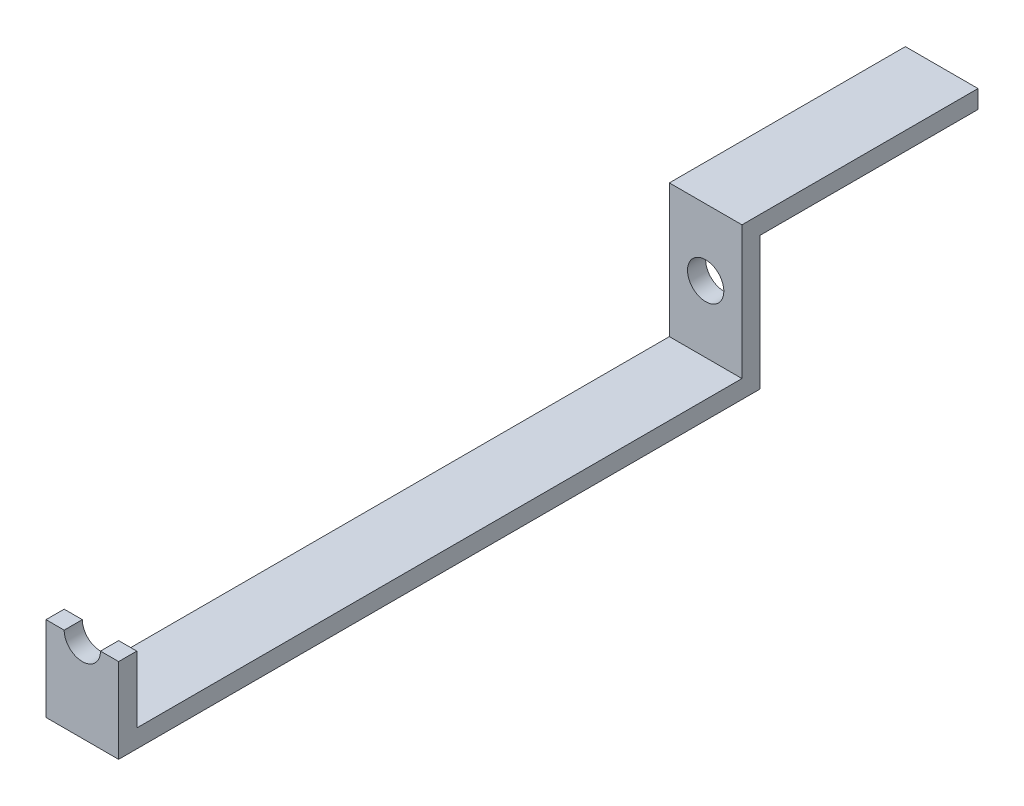
ISO-10303-21;
HEADER;
FILE_DESCRIPTION(('STEP AP214'),'2;1');
FILE_NAME('part.step','',(''),(''),'','','');
FILE_SCHEMA(('AUTOMOTIVE_DESIGN { 1 0 10303 214 1 1 1 1 }'));
ENDSEC;
DATA;
#1=APPLICATION_CONTEXT('core data for automotive mechanical design processes');
#2=APPLICATION_PROTOCOL_DEFINITION('international standard','automotive_design',2000,#1);
#3=PRODUCT_CONTEXT('',#1,'mechanical');
#4=PRODUCT('Part','Part','',(#3));
#5=PRODUCT_RELATED_PRODUCT_CATEGORY('part','',(#4));
#6=PRODUCT_DEFINITION_FORMATION('','',#4);
#7=PRODUCT_DEFINITION_CONTEXT('part definition',#1,'design');
#8=PRODUCT_DEFINITION('design','',#6,#7);
#9=PRODUCT_DEFINITION_SHAPE('','',#8);
#10=(LENGTH_UNIT() NAMED_UNIT(*) SI_UNIT(.MILLI.,.METRE.));
#11=(NAMED_UNIT(*) PLANE_ANGLE_UNIT() SI_UNIT($,.RADIAN.));
#12=(NAMED_UNIT(*) SI_UNIT($,.STERADIAN.) SOLID_ANGLE_UNIT());
#13=UNCERTAINTY_MEASURE_WITH_UNIT(LENGTH_MEASURE(1.E-05),#10,'distance_accuracy_value','');
#14=(GEOMETRIC_REPRESENTATION_CONTEXT(3) GLOBAL_UNCERTAINTY_ASSIGNED_CONTEXT((#13)) GLOBAL_UNIT_ASSIGNED_CONTEXT((#10,
#11,#12)) REPRESENTATION_CONTEXT('',''));
#15=CARTESIAN_POINT('',(0.,0.,0.));
#16=DIRECTION('',(0.,0.,1.));
#17=DIRECTION('',(1.,0.,0.));
#18=AXIS2_PLACEMENT_3D('',#15,#16,#17);
#19=CARTESIAN_POINT('',(12.,14.,53.));
#20=DIRECTION('',(0.,-1.,0.));
#21=DIRECTION('',(0.,0.,-1.));
#22=AXIS2_PLACEMENT_3D('',#19,#20,#21);
#23=PLANE('',#22);
#24=DIRECTION('',(-1.,0.,0.));
#25=VECTOR('',#24,1.);
#26=CARTESIAN_POINT('',(12.,14.,53.));
#27=LINE('',#26,#25);
#28=CARTESIAN_POINT('',(3.,14.,53.));
#29=VERTEX_POINT('',#28);
#30=CARTESIAN_POINT('',(0.,14.,53.));
#31=VERTEX_POINT('',#30);
#32=EDGE_CURVE('E197',#29,#31,#27,.T.);
#33=ORIENTED_EDGE('',*,*,#32,.F.);
#34=DIRECTION('',(0.,0.,-1.));
#35=VECTOR('',#34,1.);
#36=CARTESIAN_POINT('',(3.,14.,61.4852813742386));
#37=LINE('',#36,#35);
#38=CARTESIAN_POINT('',(3.,14.,50.));
#39=VERTEX_POINT('',#38);
#40=EDGE_CURVE('E225',#29,#39,#37,.T.);
#41=ORIENTED_EDGE('',*,*,#40,.T.);
#42=DIRECTION('',(-1.,0.,0.));
#43=VECTOR('',#42,1.);
#44=CARTESIAN_POINT('',(12.,14.,50.));
#45=LINE('',#44,#43);
#46=CARTESIAN_POINT('',(0.,14.,50.));
#47=VERTEX_POINT('',#46);
#48=EDGE_CURVE('E98',#39,#47,#45,.T.);
#49=ORIENTED_EDGE('',*,*,#48,.T.);
#50=DIRECTION('',(0.,0.,1.));
#51=VECTOR('',#50,1.);
#52=CARTESIAN_POINT('',(0.,14.,53.));
#53=LINE('',#52,#51);
#54=EDGE_CURVE('E155',#47,#31,#53,.T.);
#55=ORIENTED_EDGE('',*,*,#54,.T.);
#56=EDGE_LOOP('',(#33,#41,#49,#55));
#57=FACE_BOUND('',#56,.T.);
#58=ADVANCED_FACE('F35',(#57),#23,.F.);
#59=CARTESIAN_POINT('',(12.,14.,50.));
#60=VERTEX_POINT('',#59);
#61=CARTESIAN_POINT('',(9.,14.,50.));
#62=VERTEX_POINT('',#61);
#63=EDGE_CURVE('E178',#60,#62,#45,.T.);
#64=ORIENTED_EDGE('',*,*,#63,.T.);
#65=DIRECTION('',(0.,0.,-1.));
#66=VECTOR('',#65,1.);
#67=CARTESIAN_POINT('',(9.,14.,61.4852813742386));
#68=LINE('',#67,#66);
#69=CARTESIAN_POINT('',(9.,14.,53.));
#70=VERTEX_POINT('',#69);
#71=EDGE_CURVE('E50',#62,#70,#68,.F.);
#72=ORIENTED_EDGE('',*,*,#71,.T.);
#73=CARTESIAN_POINT('',(12.,14.,53.));
#74=VERTEX_POINT('',#73);
#75=EDGE_CURVE('E43',#74,#70,#27,.T.);
#76=ORIENTED_EDGE('',*,*,#75,.F.);
#77=DIRECTION('',(0.,0.,1.));
#78=VECTOR('',#77,1.);
#79=CARTESIAN_POINT('',(12.,14.,53.));
#80=LINE('',#79,#78);
#81=EDGE_CURVE('E177',#60,#74,#80,.T.);
#82=ORIENTED_EDGE('',*,*,#81,.F.);
#83=EDGE_LOOP('',(#64,#72,#76,#82));
#84=FACE_BOUND('',#83,.T.);
#85=ADVANCED_FACE('F37',(#84),#23,.F.);
#86=CARTESIAN_POINT('',(12.,0.,53.));
#87=DIRECTION('',(0.,0.,-1.));
#88=DIRECTION('',(-1.,0.,0.));
#89=AXIS2_PLACEMENT_3D('',#86,#87,#88);
#90=PLANE('',#89);
#91=ORIENTED_EDGE('',*,*,#75,.T.);
#92=CARTESIAN_POINT('',(6.,14.,53.));
#93=DIRECTION('',(0.,0.,-1.));
#94=DIRECTION('',(-1.,0.,0.));
#95=AXIS2_PLACEMENT_3D('',#92,#93,#94);
#96=CIRCLE('',#95,3.);
#97=EDGE_CURVE('E205',#29,#70,#96,.F.);
#98=ORIENTED_EDGE('',*,*,#97,.F.);
#99=ORIENTED_EDGE('',*,*,#32,.T.);
#100=DIRECTION('',(0.,-1.,0.));
#101=VECTOR('',#100,1.);
#102=CARTESIAN_POINT('',(0.,0.,53.));
#103=LINE('',#102,#101);
#104=CARTESIAN_POINT('',(0.,0.,53.));
#105=VERTEX_POINT('',#104);
#106=EDGE_CURVE('E157',#31,#105,#103,.T.);
#107=ORIENTED_EDGE('',*,*,#106,.T.);
#108=DIRECTION('',(-1.,0.,0.));
#109=VECTOR('',#108,1.);
#110=CARTESIAN_POINT('',(12.,0.,53.));
#111=LINE('',#110,#109);
#112=CARTESIAN_POINT('',(12.,0.,53.));
#113=VERTEX_POINT('',#112);
#114=EDGE_CURVE('E195',#113,#105,#111,.T.);
#115=ORIENTED_EDGE('',*,*,#114,.F.);
#116=DIRECTION('',(0.,-1.,0.));
#117=VECTOR('',#116,1.);
#118=CARTESIAN_POINT('',(12.,0.,53.));
#119=LINE('',#118,#117);
#120=EDGE_CURVE('E107',#74,#113,#119,.T.);
#121=ORIENTED_EDGE('',*,*,#120,.F.);
#122=EDGE_LOOP('',(#91,#98,#99,#107,#115,#121));
#123=FACE_BOUND('',#122,.T.);
#124=ADVANCED_FACE('F203',(#123),#90,.F.);
#125=CARTESIAN_POINT('',(12.,0.,53.));
#126=DIRECTION('',(0.,1.,0.));
#127=DIRECTION('',(0.,0.,1.));
#128=AXIS2_PLACEMENT_3D('',#125,#126,#127);
#129=PLANE('',#128);
#130=DIRECTION('',(0.,0.,-1.));
#131=VECTOR('',#130,1.);
#132=CARTESIAN_POINT('',(0.,0.,53.));
#133=LINE('',#132,#131);
#134=CARTESIAN_POINT('',(0.,0.,-53.));
#135=VERTEX_POINT('',#134);
#136=EDGE_CURVE('E160',#105,#135,#133,.T.);
#137=ORIENTED_EDGE('',*,*,#136,.T.);
#138=DIRECTION('',(-1.,0.,0.));
#139=VECTOR('',#138,1.);
#140=CARTESIAN_POINT('',(12.,0.,-53.));
#141=LINE('',#140,#139);
#142=CARTESIAN_POINT('',(12.,0.,-53.));
#143=VERTEX_POINT('',#142);
#144=EDGE_CURVE('E192',#143,#135,#141,.T.);
#145=ORIENTED_EDGE('',*,*,#144,.F.);
#146=DIRECTION('',(0.,0.,-1.));
#147=VECTOR('',#146,1.);
#148=CARTESIAN_POINT('',(12.,0.,53.));
#149=LINE('',#148,#147);
#150=EDGE_CURVE('E234',#113,#143,#149,.T.);
#151=ORIENTED_EDGE('',*,*,#150,.F.);
#152=ORIENTED_EDGE('',*,*,#114,.T.);
#153=EDGE_LOOP('',(#137,#145,#151,#152));
#154=FACE_BOUND('',#153,.T.);
#155=ADVANCED_FACE('F219',(#154),#129,.F.);
#156=CARTESIAN_POINT('',(12.,22.,-53.));
#157=DIRECTION('',(0.,0.,1.));
#158=DIRECTION('',(1.,0.,0.));
#159=AXIS2_PLACEMENT_3D('',#156,#157,#158);
#160=PLANE('',#159);
#161=CARTESIAN_POINT('',(6.,14.,-53.));
#162=DIRECTION('',(0.,0.,-1.));
#163=DIRECTION('',(-1.,0.,0.));
#164=AXIS2_PLACEMENT_3D('',#161,#162,#163);
#165=CIRCLE('',#164,3.);
#166=CARTESIAN_POINT('',(3.,14.,-53.));
#167=VERTEX_POINT('',#166);
#168=EDGE_CURVE('E295',#167,#167,#165,.T.);
#169=ORIENTED_EDGE('',*,*,#168,.F.);
#170=EDGE_LOOP('',(#169));
#171=FACE_BOUND('',#170,.T.);
#172=DIRECTION('',(0.,1.,0.));
#173=VECTOR('',#172,1.);
#174=CARTESIAN_POINT('',(0.,22.,-53.));
#175=LINE('',#174,#173);
#176=CARTESIAN_POINT('',(0.,22.,-53.));
#177=VERTEX_POINT('',#176);
#178=EDGE_CURVE('E163',#135,#177,#175,.T.);
#179=ORIENTED_EDGE('',*,*,#178,.T.);
#180=DIRECTION('',(-1.,0.,0.));
#181=VECTOR('',#180,1.);
#182=CARTESIAN_POINT('',(12.,22.,-53.));
#183=LINE('',#182,#181);
#184=CARTESIAN_POINT('',(12.,22.,-53.));
#185=VERTEX_POINT('',#184);
#186=EDGE_CURVE('E189',#185,#177,#183,.T.);
#187=ORIENTED_EDGE('',*,*,#186,.F.);
#188=DIRECTION('',(0.,1.,0.));
#189=VECTOR('',#188,1.);
#190=CARTESIAN_POINT('',(12.,0.,-53.));
#191=LINE('',#190,#189);
#192=EDGE_CURVE('E236',#143,#185,#191,.T.);
#193=ORIENTED_EDGE('',*,*,#192,.F.);
#194=ORIENTED_EDGE('',*,*,#144,.T.);
#195=EDGE_LOOP('',(#179,#187,#193,#194));
#196=FACE_BOUND('',#195,.T.);
#197=ADVANCED_FACE('F257',(#171,#196),#160,.F.);
#198=CARTESIAN_POINT('',(12.,22.,-89.));
#199=DIRECTION('',(0.,1.,0.));
#200=DIRECTION('',(0.,0.,1.));
#201=AXIS2_PLACEMENT_3D('',#198,#199,#200);
#202=PLANE('',#201);
#203=DIRECTION('',(0.,0.,-1.));
#204=VECTOR('',#203,1.);
#205=CARTESIAN_POINT('',(0.,22.,-89.));
#206=LINE('',#205,#204);
#207=CARTESIAN_POINT('',(0.,22.,-89.));
#208=VERTEX_POINT('',#207);
#209=EDGE_CURVE('E165',#177,#208,#206,.T.);
#210=ORIENTED_EDGE('',*,*,#209,.T.);
#211=DIRECTION('',(-1.,0.,0.));
#212=VECTOR('',#211,1.);
#213=CARTESIAN_POINT('',(12.,22.,-89.));
#214=LINE('',#213,#212);
#215=CARTESIAN_POINT('',(12.,22.,-89.));
#216=VERTEX_POINT('',#215);
#217=EDGE_CURVE('E186',#216,#208,#214,.T.);
#218=ORIENTED_EDGE('',*,*,#217,.F.);
#219=DIRECTION('',(0.,0.,-1.));
#220=VECTOR('',#219,1.);
#221=CARTESIAN_POINT('',(12.,22.,-89.));
#222=LINE('',#221,#220);
#223=EDGE_CURVE('E238',#185,#216,#222,.T.);
#224=ORIENTED_EDGE('',*,*,#223,.F.);
#225=ORIENTED_EDGE('',*,*,#186,.T.);
#226=EDGE_LOOP('',(#210,#218,#224,#225));
#227=FACE_BOUND('',#226,.T.);
#228=ADVANCED_FACE('F253',(#227),#202,.F.);
#229=CARTESIAN_POINT('',(12.,25.,-89.));
#230=DIRECTION('',(0.,0.,1.));
#231=DIRECTION('',(1.,0.,0.));
#232=AXIS2_PLACEMENT_3D('',#229,#230,#231);
#233=PLANE('',#232);
#234=DIRECTION('',(0.,1.,0.));
#235=VECTOR('',#234,1.);
#236=CARTESIAN_POINT('',(0.,25.,-89.));
#237=LINE('',#236,#235);
#238=CARTESIAN_POINT('',(0.,25.,-89.));
#239=VERTEX_POINT('',#238);
#240=EDGE_CURVE('E167',#208,#239,#237,.T.);
#241=ORIENTED_EDGE('',*,*,#240,.T.);
#242=DIRECTION('',(-1.,0.,0.));
#243=VECTOR('',#242,1.);
#244=CARTESIAN_POINT('',(12.,25.,-89.));
#245=LINE('',#244,#243);
#246=CARTESIAN_POINT('',(12.,25.,-89.));
#247=VERTEX_POINT('',#246);
#248=EDGE_CURVE('E183',#247,#239,#245,.T.);
#249=ORIENTED_EDGE('',*,*,#248,.F.);
#250=DIRECTION('',(0.,1.,0.));
#251=VECTOR('',#250,1.);
#252=CARTESIAN_POINT('',(12.,25.,-89.));
#253=LINE('',#252,#251);
#254=EDGE_CURVE('E240',#216,#247,#253,.T.);
#255=ORIENTED_EDGE('',*,*,#254,.F.);
#256=ORIENTED_EDGE('',*,*,#217,.T.);
#257=EDGE_LOOP('',(#241,#249,#255,#256));
#258=FACE_BOUND('',#257,.T.);
#259=ADVANCED_FACE('F246',(#258),#233,.F.);
#260=CARTESIAN_POINT('',(12.,25.,-50.));
#261=DIRECTION('',(0.,-1.,0.));
#262=DIRECTION('',(0.,0.,-1.));
#263=AXIS2_PLACEMENT_3D('',#260,#261,#262);
#264=PLANE('',#263);
#265=DIRECTION('',(0.,0.,1.));
#266=VECTOR('',#265,1.);
#267=CARTESIAN_POINT('',(0.,25.,-50.));
#268=LINE('',#267,#266);
#269=CARTESIAN_POINT('',(0.,25.,-50.));
#270=VERTEX_POINT('',#269);
#271=EDGE_CURVE('E169',#239,#270,#268,.T.);
#272=ORIENTED_EDGE('',*,*,#271,.T.);
#273=DIRECTION('',(-1.,0.,0.));
#274=VECTOR('',#273,1.);
#275=CARTESIAN_POINT('',(12.,25.,-50.));
#276=LINE('',#275,#274);
#277=CARTESIAN_POINT('',(12.,25.,-50.));
#278=VERTEX_POINT('',#277);
#279=EDGE_CURVE('E146',#278,#270,#276,.T.);
#280=ORIENTED_EDGE('',*,*,#279,.F.);
#281=DIRECTION('',(0.,0.,1.));
#282=VECTOR('',#281,1.);
#283=CARTESIAN_POINT('',(12.,25.,-50.));
#284=LINE('',#283,#282);
#285=EDGE_CURVE('E135',#247,#278,#284,.T.);
#286=ORIENTED_EDGE('',*,*,#285,.F.);
#287=ORIENTED_EDGE('',*,*,#248,.T.);
#288=EDGE_LOOP('',(#272,#280,#286,#287));
#289=FACE_BOUND('',#288,.T.);
#290=ADVANCED_FACE('F250',(#289),#264,.F.);
#291=CARTESIAN_POINT('',(12.,20.,-50.));
#292=DIRECTION('',(0.,0.,-1.));
#293=DIRECTION('',(0.,1.,0.));
#294=AXIS2_PLACEMENT_3D('',#291,#292,#293);
#295=PLANE('',#294);
#296=CARTESIAN_POINT('',(6.,14.,-50.));
#297=DIRECTION('',(0.,0.,-1.));
#298=DIRECTION('',(0.,1.,0.));
#299=AXIS2_PLACEMENT_3D('',#296,#297,#298);
#300=CIRCLE('',#299,3.);
#301=CARTESIAN_POINT('',(6.,17.,-50.));
#302=VERTEX_POINT('',#301);
#303=EDGE_CURVE('E158',#302,#302,#300,.T.);
#304=ORIENTED_EDGE('',*,*,#303,.T.);
#305=EDGE_LOOP('',(#304));
#306=FACE_BOUND('',#305,.T.);
#307=DIRECTION('',(0.,-1.,0.));
#308=VECTOR('',#307,1.);
#309=CARTESIAN_POINT('',(0.,20.,-50.));
#310=LINE('',#309,#308);
#311=CARTESIAN_POINT('',(0.,3.00000000000001,-50.));
#312=VERTEX_POINT('',#311);
#313=EDGE_CURVE('E143',#270,#312,#310,.T.);
#314=ORIENTED_EDGE('',*,*,#313,.T.);
#315=DIRECTION('',(-1.,0.,0.));
#316=VECTOR('',#315,1.);
#317=CARTESIAN_POINT('',(12.,3.00000000000001,-50.));
#318=LINE('',#317,#316);
#319=CARTESIAN_POINT('',(12.,3.00000000000001,-50.));
#320=VERTEX_POINT('',#319);
#321=EDGE_CURVE('E141',#320,#312,#318,.T.);
#322=ORIENTED_EDGE('',*,*,#321,.F.);
#323=DIRECTION('',(0.,-1.,0.));
#324=VECTOR('',#323,1.);
#325=CARTESIAN_POINT('',(12.,20.,-50.));
#326=LINE('',#325,#324);
#327=EDGE_CURVE('E128',#278,#320,#326,.T.);
#328=ORIENTED_EDGE('',*,*,#327,.F.);
#329=ORIENTED_EDGE('',*,*,#279,.T.);
#330=EDGE_LOOP('',(#314,#322,#328,#329));
#331=FACE_BOUND('',#330,.T.);
#332=ADVANCED_FACE('F142',(#306,#331),#295,.F.);
#333=CARTESIAN_POINT('',(12.,3.00000000000001,-50.));
#334=DIRECTION('',(0.,-1.,0.));
#335=DIRECTION('',(0.,0.,-1.));
#336=AXIS2_PLACEMENT_3D('',#333,#334,#335);
#337=PLANE('',#336);
#338=DIRECTION('',(0.,0.,1.));
#339=VECTOR('',#338,1.);
#340=CARTESIAN_POINT('',(0.,3.00000000000001,-50.));
#341=LINE('',#340,#339);
#342=CARTESIAN_POINT('',(0.,3.00000000000001,50.));
#343=VERTEX_POINT('',#342);
#344=EDGE_CURVE('E173',#312,#343,#341,.T.);
#345=ORIENTED_EDGE('',*,*,#344,.T.);
#346=DIRECTION('',(-1.,0.,0.));
#347=VECTOR('',#346,1.);
#348=CARTESIAN_POINT('',(12.,3.00000000000001,50.));
#349=LINE('',#348,#347);
#350=CARTESIAN_POINT('',(12.,3.00000000000001,50.));
#351=VERTEX_POINT('',#350);
#352=EDGE_CURVE('E147',#351,#343,#349,.T.);
#353=ORIENTED_EDGE('',*,*,#352,.F.);
#354=DIRECTION('',(0.,0.,1.));
#355=VECTOR('',#354,1.);
#356=CARTESIAN_POINT('',(12.,3.00000000000001,-50.));
#357=LINE('',#356,#355);
#358=EDGE_CURVE('E132',#320,#351,#357,.T.);
#359=ORIENTED_EDGE('',*,*,#358,.F.);
#360=ORIENTED_EDGE('',*,*,#321,.T.);
#361=EDGE_LOOP('',(#345,#353,#359,#360));
#362=FACE_BOUND('',#361,.T.);
#363=ADVANCED_FACE('F149',(#362),#337,.F.);
#364=CARTESIAN_POINT('',(12.,14.,50.));
#365=DIRECTION('',(0.,0.,1.));
#366=DIRECTION('',(0.,-1.,0.));
#367=AXIS2_PLACEMENT_3D('',#364,#365,#366);
#368=PLANE('',#367);
#369=ORIENTED_EDGE('',*,*,#48,.F.);
#370=CARTESIAN_POINT('',(6.,14.,50.));
#371=DIRECTION('',(0.,0.,1.));
#372=DIRECTION('',(0.,-1.,0.));
#373=AXIS2_PLACEMENT_3D('',#370,#371,#372);
#374=CIRCLE('',#373,3.);
#375=EDGE_CURVE('E11',#39,#62,#374,.T.);
#376=ORIENTED_EDGE('',*,*,#375,.T.);
#377=ORIENTED_EDGE('',*,*,#63,.F.);
#378=DIRECTION('',(0.,1.,0.));
#379=VECTOR('',#378,1.);
#380=CARTESIAN_POINT('',(12.,14.,50.));
#381=LINE('',#380,#379);
#382=EDGE_CURVE('E58',#351,#60,#381,.T.);
#383=ORIENTED_EDGE('',*,*,#382,.F.);
#384=ORIENTED_EDGE('',*,*,#352,.T.);
#385=DIRECTION('',(0.,1.,0.));
#386=VECTOR('',#385,1.);
#387=CARTESIAN_POINT('',(0.,14.,50.));
#388=LINE('',#387,#386);
#389=EDGE_CURVE('E175',#343,#47,#388,.T.);
#390=ORIENTED_EDGE('',*,*,#389,.T.);
#391=EDGE_LOOP('',(#369,#376,#377,#383,#384,#390));
#392=FACE_BOUND('',#391,.T.);
#393=ADVANCED_FACE('F222',(#392),#368,.F.);
#394=CARTESIAN_POINT('',(12.,0.,0.));
#395=DIRECTION('',(-1.,0.,0.));
#396=DIRECTION('',(0.,0.,1.));
#397=AXIS2_PLACEMENT_3D('',#394,#395,#396);
#398=PLANE('',#397);
#399=ORIENTED_EDGE('',*,*,#81,.T.);
#400=ORIENTED_EDGE('',*,*,#120,.T.);
#401=ORIENTED_EDGE('',*,*,#150,.T.);
#402=ORIENTED_EDGE('',*,*,#192,.T.);
#403=ORIENTED_EDGE('',*,*,#223,.T.);
#404=ORIENTED_EDGE('',*,*,#254,.T.);
#405=ORIENTED_EDGE('',*,*,#285,.T.);
#406=ORIENTED_EDGE('',*,*,#327,.T.);
#407=ORIENTED_EDGE('',*,*,#358,.T.);
#408=ORIENTED_EDGE('',*,*,#382,.T.);
#409=EDGE_LOOP('',(#399,#400,#401,#402,#403,#404,#405,#406,#407,#408));
#410=FACE_BOUND('',#409,.T.);
#411=ADVANCED_FACE('F130',(#410),#398,.F.);
#412=CARTESIAN_POINT('',(0.,0.,0.));
#413=DIRECTION('',(-1.,0.,0.));
#414=DIRECTION('',(0.,0.,1.));
#415=AXIS2_PLACEMENT_3D('',#412,#413,#414);
#416=PLANE('',#415);
#417=ORIENTED_EDGE('',*,*,#54,.F.);
#418=ORIENTED_EDGE('',*,*,#389,.F.);
#419=ORIENTED_EDGE('',*,*,#344,.F.);
#420=ORIENTED_EDGE('',*,*,#313,.F.);
#421=ORIENTED_EDGE('',*,*,#271,.F.);
#422=ORIENTED_EDGE('',*,*,#240,.F.);
#423=ORIENTED_EDGE('',*,*,#209,.F.);
#424=ORIENTED_EDGE('',*,*,#178,.F.);
#425=ORIENTED_EDGE('',*,*,#136,.F.);
#426=ORIENTED_EDGE('',*,*,#106,.F.);
#427=EDGE_LOOP('',(#417,#418,#419,#420,#421,#422,#423,#424,#425,#426));
#428=FACE_BOUND('',#427,.T.);
#429=ADVANCED_FACE('F209',(#428),#416,.T.);
#430=CARTESIAN_POINT('',(6.,14.,61.4852813742386));
#431=DIRECTION('',(0.,0.,-1.));
#432=DIRECTION('',(-1.,0.,0.));
#433=AXIS2_PLACEMENT_3D('',#430,#431,#432);
#434=CYLINDRICAL_SURFACE('',#433,3.);
#435=ORIENTED_EDGE('',*,*,#97,.T.);
#436=ORIENTED_EDGE('',*,*,#71,.F.);
#437=ORIENTED_EDGE('',*,*,#375,.F.);
#438=ORIENTED_EDGE('',*,*,#40,.F.);
#439=EDGE_LOOP('',(#435,#436,#437,#438));
#440=FACE_BOUND('',#439,.T.);
#441=ADVANCED_FACE('F224',(#440),#434,.F.);
#442=ORIENTED_EDGE('',*,*,#168,.T.);
#443=EDGE_LOOP('',(#442));
#444=FACE_BOUND('',#443,.T.);
#445=ORIENTED_EDGE('',*,*,#303,.F.);
#446=EDGE_LOOP('',(#445));
#447=FACE_BOUND('',#446,.T.);
#448=ADVANCED_FACE('F286',(#444,#447),#434,.F.);
#449=CLOSED_SHELL('',(#58,#85,#124,#155,#197,#228,#259,#290,#332,#363,#393,#411,#429,#441,#448));
#450=MANIFOLD_SOLID_BREP('B2',#449);
#451=ADVANCED_BREP_SHAPE_REPRESENTATION('',(#18,#450),#14);
#452=SHAPE_DEFINITION_REPRESENTATION(#9,#451);
ENDSEC;
END-ISO-10303-21;
